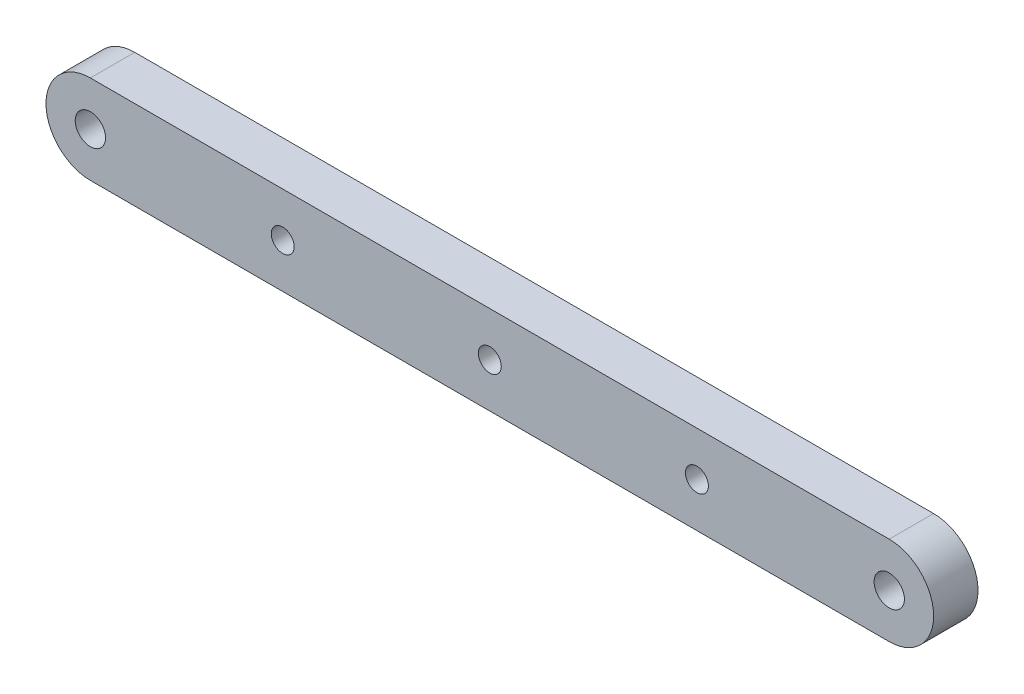
ISO-10303-21;
HEADER;
FILE_DESCRIPTION(('STEP AP214'),'2;1');
FILE_NAME('part.step','',(''),(''),'','','');
FILE_SCHEMA(('AUTOMOTIVE_DESIGN { 1 0 10303 214 1 1 1 1 }'));
ENDSEC;
DATA;
#1=APPLICATION_CONTEXT('core data for automotive mechanical design processes');
#2=APPLICATION_PROTOCOL_DEFINITION('international standard','automotive_design',2000,#1);
#3=PRODUCT_CONTEXT('',#1,'mechanical');
#4=PRODUCT('Part','Part','',(#3));
#5=PRODUCT_RELATED_PRODUCT_CATEGORY('part','',(#4));
#6=PRODUCT_DEFINITION_FORMATION('','',#4);
#7=PRODUCT_DEFINITION_CONTEXT('part definition',#1,'design');
#8=PRODUCT_DEFINITION('design','',#6,#7);
#9=PRODUCT_DEFINITION_SHAPE('','',#8);
#10=(LENGTH_UNIT() NAMED_UNIT(*) SI_UNIT(.MILLI.,.METRE.));
#11=(NAMED_UNIT(*) PLANE_ANGLE_UNIT() SI_UNIT($,.RADIAN.));
#12=(NAMED_UNIT(*) SI_UNIT($,.STERADIAN.) SOLID_ANGLE_UNIT());
#13=UNCERTAINTY_MEASURE_WITH_UNIT(LENGTH_MEASURE(1.E-05),#10,'distance_accuracy_value','');
#14=(GEOMETRIC_REPRESENTATION_CONTEXT(3) GLOBAL_UNCERTAINTY_ASSIGNED_CONTEXT((#13)) GLOBAL_UNIT_ASSIGNED_CONTEXT((#10,
#11,#12)) REPRESENTATION_CONTEXT('',''));
#15=CARTESIAN_POINT('',(0.,0.,0.));
#16=DIRECTION('',(0.,0.,1.));
#17=DIRECTION('',(1.,0.,0.));
#18=AXIS2_PLACEMENT_3D('',#15,#16,#17);
#19=CARTESIAN_POINT('',(135.201456631758,11.7039696358885,6.));
#20=DIRECTION('',(0.,0.,-1.));
#21=DIRECTION('',(-1.,0.,0.));
#22=AXIS2_PLACEMENT_3D('',#19,#20,#21);
#23=CYLINDRICAL_SURFACE('',#22,6.);
#24=CARTESIAN_POINT('',(135.201456631758,11.7039696358885,0.));
#25=DIRECTION('',(0.,0.,1.));
#26=DIRECTION('',(1.,0.,0.));
#27=AXIS2_PLACEMENT_3D('',#24,#25,#26);
#28=CIRCLE('',#27,6.);
#29=CARTESIAN_POINT('',(135.201456631758,5.70396963588848,0.));
#30=VERTEX_POINT('',#29);
#31=CARTESIAN_POINT('',(135.201456631758,17.7039696358885,0.));
#32=VERTEX_POINT('',#31);
#33=EDGE_CURVE('E112',#30,#32,#28,.T.);
#34=ORIENTED_EDGE('',*,*,#33,.T.);
#35=DIRECTION('',(0.,0.,-1.));
#36=VECTOR('',#35,1.);
#37=CARTESIAN_POINT('',(135.201456631758,17.7039696358885,6.));
#38=LINE('',#37,#36);
#39=CARTESIAN_POINT('',(135.201456631758,17.7039696358885,6.));
#40=VERTEX_POINT('',#39);
#41=EDGE_CURVE('E11',#40,#32,#38,.T.);
#42=ORIENTED_EDGE('',*,*,#41,.F.);
#43=CARTESIAN_POINT('',(135.201456631758,11.7039696358885,6.));
#44=DIRECTION('',(0.,0.,1.));
#45=DIRECTION('',(1.,0.,0.));
#46=AXIS2_PLACEMENT_3D('',#43,#44,#45);
#47=CIRCLE('',#46,6.);
#48=CARTESIAN_POINT('',(135.201456631758,5.70396963588848,6.));
#49=VERTEX_POINT('',#48);
#50=EDGE_CURVE('E96',#49,#40,#47,.T.);
#51=ORIENTED_EDGE('',*,*,#50,.F.);
#52=DIRECTION('',(0.,0.,-1.));
#53=VECTOR('',#52,1.);
#54=CARTESIAN_POINT('',(135.201456631758,5.70396963588848,6.));
#55=LINE('',#54,#53);
#56=EDGE_CURVE('E108',#49,#30,#55,.T.);
#57=ORIENTED_EDGE('',*,*,#56,.T.);
#58=EDGE_LOOP('',(#34,#42,#51,#57));
#59=FACE_BOUND('',#58,.T.);
#60=ADVANCED_FACE('F41',(#59),#23,.T.);
#61=CARTESIAN_POINT('',(135.201456631758,17.7039696358885,6.));
#62=DIRECTION('',(0.,-1.,0.));
#63=DIRECTION('',(1.,0.,0.));
#64=AXIS2_PLACEMENT_3D('',#61,#62,#63);
#65=PLANE('',#64);
#66=DIRECTION('',(-1.,0.,0.));
#67=VECTOR('',#66,1.);
#68=CARTESIAN_POINT('',(135.201456631758,17.7039696358885,0.));
#69=LINE('',#68,#67);
#70=CARTESIAN_POINT('',(27.201456631758,17.7039696358885,0.));
#71=VERTEX_POINT('',#70);
#72=EDGE_CURVE('E101',#32,#71,#69,.T.);
#73=ORIENTED_EDGE('',*,*,#72,.T.);
#74=DIRECTION('',(0.,0.,-1.));
#75=VECTOR('',#74,1.);
#76=CARTESIAN_POINT('',(27.201456631758,17.7039696358885,6.));
#77=LINE('',#76,#75);
#78=CARTESIAN_POINT('',(27.201456631758,17.7039696358885,6.));
#79=VERTEX_POINT('',#78);
#80=EDGE_CURVE('E49',#79,#71,#77,.T.);
#81=ORIENTED_EDGE('',*,*,#80,.F.);
#82=DIRECTION('',(-1.,0.,0.));
#83=VECTOR('',#82,1.);
#84=CARTESIAN_POINT('',(135.201456631758,17.7039696358885,6.));
#85=LINE('',#84,#83);
#86=EDGE_CURVE('E91',#40,#79,#85,.T.);
#87=ORIENTED_EDGE('',*,*,#86,.F.);
#88=ORIENTED_EDGE('',*,*,#41,.T.);
#89=EDGE_LOOP('',(#73,#81,#87,#88));
#90=FACE_BOUND('',#89,.T.);
#91=ADVANCED_FACE('F100',(#90),#65,.F.);
#92=CARTESIAN_POINT('',(27.201456631758,11.7039696358885,6.));
#93=DIRECTION('',(0.,0.,-1.));
#94=DIRECTION('',(-1.,0.,0.));
#95=AXIS2_PLACEMENT_3D('',#92,#93,#94);
#96=CYLINDRICAL_SURFACE('',#95,6.);
#97=CARTESIAN_POINT('',(27.201456631758,11.7039696358885,0.));
#98=DIRECTION('',(0.,0.,1.));
#99=DIRECTION('',(1.,0.,0.));
#100=AXIS2_PLACEMENT_3D('',#97,#98,#99);
#101=CIRCLE('',#100,6.);
#102=CARTESIAN_POINT('',(27.201456631758,5.70396963588848,0.));
#103=VERTEX_POINT('',#102);
#104=EDGE_CURVE('E78',#71,#103,#101,.T.);
#105=ORIENTED_EDGE('',*,*,#104,.T.);
#106=DIRECTION('',(0.,0.,-1.));
#107=VECTOR('',#106,1.);
#108=CARTESIAN_POINT('',(27.201456631758,5.70396963588848,6.));
#109=LINE('',#108,#107);
#110=CARTESIAN_POINT('',(27.201456631758,5.70396963588848,6.));
#111=VERTEX_POINT('',#110);
#112=EDGE_CURVE('E103',#111,#103,#109,.T.);
#113=ORIENTED_EDGE('',*,*,#112,.F.);
#114=CARTESIAN_POINT('',(27.201456631758,11.7039696358885,6.));
#115=DIRECTION('',(0.,0.,1.));
#116=DIRECTION('',(1.,0.,0.));
#117=AXIS2_PLACEMENT_3D('',#114,#115,#116);
#118=CIRCLE('',#117,6.);
#119=EDGE_CURVE('E94',#79,#111,#118,.T.);
#120=ORIENTED_EDGE('',*,*,#119,.F.);
#121=ORIENTED_EDGE('',*,*,#80,.T.);
#122=EDGE_LOOP('',(#105,#113,#120,#121));
#123=FACE_BOUND('',#122,.T.);
#124=ADVANCED_FACE('F104',(#123),#96,.T.);
#125=CARTESIAN_POINT('',(135.201456631758,5.70396963588848,6.));
#126=DIRECTION('',(0.,1.,0.));
#127=DIRECTION('',(0.,0.,1.));
#128=AXIS2_PLACEMENT_3D('',#125,#126,#127);
#129=PLANE('',#128);
#130=DIRECTION('',(1.,0.,0.));
#131=VECTOR('',#130,1.);
#132=CARTESIAN_POINT('',(135.201456631758,5.70396963588848,0.));
#133=LINE('',#132,#131);
#134=EDGE_CURVE('E84',#103,#30,#133,.T.);
#135=ORIENTED_EDGE('',*,*,#134,.T.);
#136=ORIENTED_EDGE('',*,*,#56,.F.);
#137=DIRECTION('',(1.,0.,0.));
#138=VECTOR('',#137,1.);
#139=CARTESIAN_POINT('',(135.201456631758,5.70396963588848,6.));
#140=LINE('',#139,#138);
#141=EDGE_CURVE('E57',#111,#49,#140,.T.);
#142=ORIENTED_EDGE('',*,*,#141,.F.);
#143=ORIENTED_EDGE('',*,*,#112,.T.);
#144=EDGE_LOOP('',(#135,#136,#142,#143));
#145=FACE_BOUND('',#144,.T.);
#146=ADVANCED_FACE('F125',(#145),#129,.F.);
#147=CARTESIAN_POINT('',(135.201456631758,11.7039696358885,6.));
#148=DIRECTION('',(0.,0.,1.));
#149=DIRECTION('',(1.,0.,0.));
#150=AXIS2_PLACEMENT_3D('',#147,#148,#149);
#151=PLANE('',#150);
#152=CARTESIAN_POINT('',(109.201456631917,11.7039696364994,6.));
#153=DIRECTION('',(0.,0.,1.));
#154=DIRECTION('',(1.,0.,0.));
#155=AXIS2_PLACEMENT_3D('',#152,#153,#154);
#156=CIRCLE('',#155,1.54999999966958);
#157=CARTESIAN_POINT('',(110.751456631586,11.7039696364994,6.));
#158=VERTEX_POINT('',#157);
#159=EDGE_CURVE('E158',#158,#158,#156,.T.);
#160=ORIENTED_EDGE('',*,*,#159,.F.);
#161=EDGE_LOOP('',(#160));
#162=FACE_BOUND('',#161,.T.);
#163=CARTESIAN_POINT('',(81.2014566319167,11.7039696364994,6.));
#164=DIRECTION('',(0.,0.,1.));
#165=DIRECTION('',(1.,0.,0.));
#166=AXIS2_PLACEMENT_3D('',#163,#164,#165);
#167=CIRCLE('',#166,1.54999999966958);
#168=CARTESIAN_POINT('',(82.7514566315863,11.7039696364994,6.));
#169=VERTEX_POINT('',#168);
#170=EDGE_CURVE('E152',#169,#169,#167,.T.);
#171=ORIENTED_EDGE('',*,*,#170,.F.);
#172=EDGE_LOOP('',(#171));
#173=FACE_BOUND('',#172,.T.);
#174=CARTESIAN_POINT('',(53.2014566319167,11.7039696364994,6.));
#175=DIRECTION('',(0.,0.,1.));
#176=DIRECTION('',(1.,0.,0.));
#177=AXIS2_PLACEMENT_3D('',#174,#175,#176);
#178=CIRCLE('',#177,1.54999999966958);
#179=CARTESIAN_POINT('',(54.7514566315863,11.7039696364994,6.));
#180=VERTEX_POINT('',#179);
#181=EDGE_CURVE('E145',#180,#180,#178,.T.);
#182=ORIENTED_EDGE('',*,*,#181,.F.);
#183=EDGE_LOOP('',(#182));
#184=FACE_BOUND('',#183,.T.);
#185=CARTESIAN_POINT('',(27.201456631758,11.7039696358885,6.));
#186=DIRECTION('',(0.,0.,1.));
#187=DIRECTION('',(1.,0.,0.));
#188=AXIS2_PLACEMENT_3D('',#185,#186,#187);
#189=CIRCLE('',#188,2.05);
#190=CARTESIAN_POINT('',(29.251456631758,11.7039696358885,6.));
#191=VERTEX_POINT('',#190);
#192=EDGE_CURVE('E137',#191,#191,#189,.T.);
#193=ORIENTED_EDGE('',*,*,#192,.F.);
#194=EDGE_LOOP('',(#193));
#195=FACE_BOUND('',#194,.T.);
#196=CARTESIAN_POINT('',(135.201456631758,11.7039696358885,6.));
#197=DIRECTION('',(0.,0.,1.));
#198=DIRECTION('',(1.,0.,0.));
#199=AXIS2_PLACEMENT_3D('',#196,#197,#198);
#200=CIRCLE('',#199,2.04999999999999);
#201=CARTESIAN_POINT('',(137.251456631758,11.7039696358885,6.));
#202=VERTEX_POINT('',#201);
#203=EDGE_CURVE('E131',#202,#202,#200,.T.);
#204=ORIENTED_EDGE('',*,*,#203,.F.);
#205=EDGE_LOOP('',(#204));
#206=FACE_BOUND('',#205,.T.);
#207=ORIENTED_EDGE('',*,*,#50,.T.);
#208=ORIENTED_EDGE('',*,*,#86,.T.);
#209=ORIENTED_EDGE('',*,*,#119,.T.);
#210=ORIENTED_EDGE('',*,*,#141,.T.);
#211=EDGE_LOOP('',(#207,#208,#209,#210));
#212=FACE_BOUND('',#211,.T.);
#213=ADVANCED_FACE('F92',(#162,#173,#184,#195,#206,#212),#151,.T.);
#214=CARTESIAN_POINT('',(135.201456631758,11.7039696358885,0.));
#215=DIRECTION('',(0.,0.,1.));
#216=DIRECTION('',(1.,0.,0.));
#217=AXIS2_PLACEMENT_3D('',#214,#215,#216);
#218=PLANE('',#217);
#219=CARTESIAN_POINT('',(109.201456631917,11.7039696364994,0.));
#220=DIRECTION('',(0.,0.,1.));
#221=DIRECTION('',(1.,0.,0.));
#222=AXIS2_PLACEMENT_3D('',#219,#220,#221);
#223=CIRCLE('',#222,1.54999999966958);
#224=CARTESIAN_POINT('',(110.751456631586,11.7039696364994,0.));
#225=VERTEX_POINT('',#224);
#226=EDGE_CURVE('E155',#225,#225,#223,.T.);
#227=ORIENTED_EDGE('',*,*,#226,.T.);
#228=EDGE_LOOP('',(#227));
#229=FACE_BOUND('',#228,.T.);
#230=CARTESIAN_POINT('',(81.2014566319167,11.7039696364994,0.));
#231=DIRECTION('',(0.,0.,1.));
#232=DIRECTION('',(1.,0.,0.));
#233=AXIS2_PLACEMENT_3D('',#230,#231,#232);
#234=CIRCLE('',#233,1.54999999966958);
#235=CARTESIAN_POINT('',(82.7514566315863,11.7039696364994,0.));
#236=VERTEX_POINT('',#235);
#237=EDGE_CURVE('E148',#236,#236,#234,.T.);
#238=ORIENTED_EDGE('',*,*,#237,.T.);
#239=EDGE_LOOP('',(#238));
#240=FACE_BOUND('',#239,.T.);
#241=CARTESIAN_POINT('',(53.2014566319167,11.7039696364994,0.));
#242=DIRECTION('',(0.,0.,1.));
#243=DIRECTION('',(1.,0.,0.));
#244=AXIS2_PLACEMENT_3D('',#241,#242,#243);
#245=CIRCLE('',#244,1.54999999966958);
#246=CARTESIAN_POINT('',(54.7514566315863,11.7039696364994,0.));
#247=VERTEX_POINT('',#246);
#248=EDGE_CURVE('E141',#247,#247,#245,.T.);
#249=ORIENTED_EDGE('',*,*,#248,.T.);
#250=EDGE_LOOP('',(#249));
#251=FACE_BOUND('',#250,.T.);
#252=CARTESIAN_POINT('',(27.201456631758,11.7039696358885,0.));
#253=DIRECTION('',(0.,0.,1.));
#254=DIRECTION('',(1.,0.,0.));
#255=AXIS2_PLACEMENT_3D('',#252,#253,#254);
#256=CIRCLE('',#255,2.05);
#257=CARTESIAN_POINT('',(29.251456631758,11.7039696358885,0.));
#258=VERTEX_POINT('',#257);
#259=EDGE_CURVE('E134',#258,#258,#256,.T.);
#260=ORIENTED_EDGE('',*,*,#259,.T.);
#261=EDGE_LOOP('',(#260));
#262=FACE_BOUND('',#261,.T.);
#263=CARTESIAN_POINT('',(135.201456631758,11.7039696358885,0.));
#264=DIRECTION('',(0.,0.,1.));
#265=DIRECTION('',(1.,0.,0.));
#266=AXIS2_PLACEMENT_3D('',#263,#264,#265);
#267=CIRCLE('',#266,2.04999999999999);
#268=CARTESIAN_POINT('',(137.251456631758,11.7039696358885,0.));
#269=VERTEX_POINT('',#268);
#270=EDGE_CURVE('E115',#269,#269,#267,.T.);
#271=ORIENTED_EDGE('',*,*,#270,.T.);
#272=EDGE_LOOP('',(#271));
#273=FACE_BOUND('',#272,.T.);
#274=ORIENTED_EDGE('',*,*,#33,.F.);
#275=ORIENTED_EDGE('',*,*,#134,.F.);
#276=ORIENTED_EDGE('',*,*,#104,.F.);
#277=ORIENTED_EDGE('',*,*,#72,.F.);
#278=EDGE_LOOP('',(#274,#275,#276,#277));
#279=FACE_BOUND('',#278,.T.);
#280=ADVANCED_FACE('F128',(#229,#240,#251,#262,#273,#279),#218,.F.);
#281=CARTESIAN_POINT('',(135.201456631758,11.7039696358885,0.));
#282=DIRECTION('',(0.,0.,1.));
#283=DIRECTION('',(1.,0.,0.));
#284=AXIS2_PLACEMENT_3D('',#281,#282,#283);
#285=CYLINDRICAL_SURFACE('',#284,2.04999999999999);
#286=ORIENTED_EDGE('',*,*,#270,.F.);
#287=EDGE_LOOP('',(#286));
#288=FACE_BOUND('',#287,.T.);
#289=ORIENTED_EDGE('',*,*,#203,.T.);
#290=EDGE_LOOP('',(#289));
#291=FACE_BOUND('',#290,.T.);
#292=ADVANCED_FACE('F184',(#288,#291),#285,.F.);
#293=CARTESIAN_POINT('',(27.201456631758,11.7039696358885,0.));
#294=DIRECTION('',(0.,0.,1.));
#295=DIRECTION('',(1.,0.,0.));
#296=AXIS2_PLACEMENT_3D('',#293,#294,#295);
#297=CYLINDRICAL_SURFACE('',#296,2.05);
#298=ORIENTED_EDGE('',*,*,#259,.F.);
#299=EDGE_LOOP('',(#298));
#300=FACE_BOUND('',#299,.T.);
#301=ORIENTED_EDGE('',*,*,#192,.T.);
#302=EDGE_LOOP('',(#301));
#303=FACE_BOUND('',#302,.T.);
#304=ADVANCED_FACE('F186',(#300,#303),#297,.F.);
#305=CARTESIAN_POINT('',(53.2014566319167,11.7039696364994,0.));
#306=DIRECTION('',(0.,0.,1.));
#307=DIRECTION('',(1.,0.,0.));
#308=AXIS2_PLACEMENT_3D('',#305,#306,#307);
#309=CYLINDRICAL_SURFACE('',#308,1.54999999966958);
#310=ORIENTED_EDGE('',*,*,#248,.F.);
#311=EDGE_LOOP('',(#310));
#312=FACE_BOUND('',#311,.T.);
#313=ORIENTED_EDGE('',*,*,#181,.T.);
#314=EDGE_LOOP('',(#313));
#315=FACE_BOUND('',#314,.T.);
#316=ADVANCED_FACE('F193',(#312,#315),#309,.F.);
#317=CARTESIAN_POINT('',(81.2014566319167,11.7039696364994,0.));
#318=DIRECTION('',(0.,0.,1.));
#319=DIRECTION('',(1.,0.,0.));
#320=AXIS2_PLACEMENT_3D('',#317,#318,#319);
#321=CYLINDRICAL_SURFACE('',#320,1.54999999966958);
#322=ORIENTED_EDGE('',*,*,#237,.F.);
#323=EDGE_LOOP('',(#322));
#324=FACE_BOUND('',#323,.T.);
#325=ORIENTED_EDGE('',*,*,#170,.T.);
#326=EDGE_LOOP('',(#325));
#327=FACE_BOUND('',#326,.T.);
#328=ADVANCED_FACE('F169',(#324,#327),#321,.F.);
#329=CARTESIAN_POINT('',(109.201456631917,11.7039696364994,0.));
#330=DIRECTION('',(0.,0.,1.));
#331=DIRECTION('',(1.,0.,0.));
#332=AXIS2_PLACEMENT_3D('',#329,#330,#331);
#333=CYLINDRICAL_SURFACE('',#332,1.54999999966958);
#334=ORIENTED_EDGE('',*,*,#226,.F.);
#335=EDGE_LOOP('',(#334));
#336=FACE_BOUND('',#335,.T.);
#337=ORIENTED_EDGE('',*,*,#159,.T.);
#338=EDGE_LOOP('',(#337));
#339=FACE_BOUND('',#338,.T.);
#340=ADVANCED_FACE('F166',(#336,#339),#333,.F.);
#341=CLOSED_SHELL('',(#60,#91,#124,#146,#213,#280,#292,#304,#316,#328,#340));
#342=MANIFOLD_SOLID_BREP('B2',#341);
#343=ADVANCED_BREP_SHAPE_REPRESENTATION('',(#18,#342),#14);
#344=SHAPE_DEFINITION_REPRESENTATION(#9,#343);
ENDSEC;
END-ISO-10303-21;
